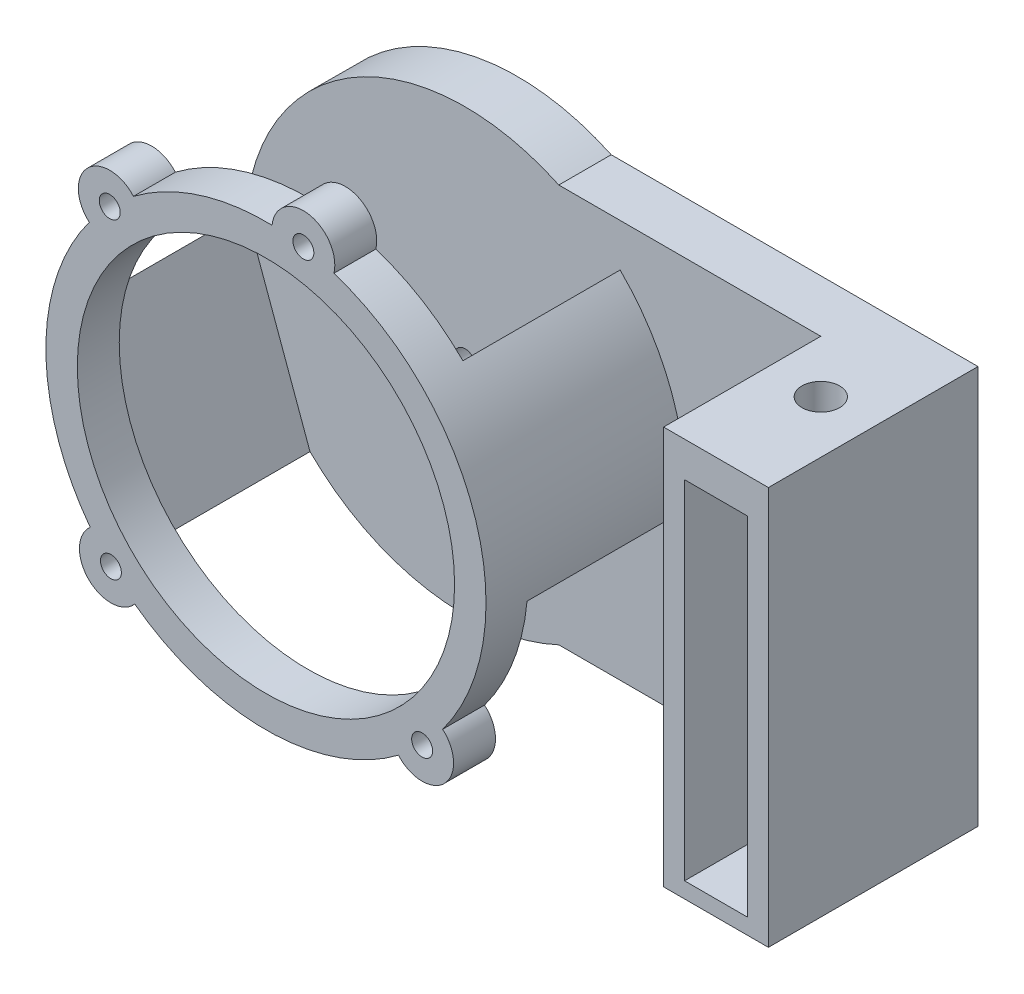
ISO-10303-21;
HEADER;
FILE_DESCRIPTION(('STEP AP214'),'2;1');
FILE_NAME('part.step','',(''),(''),'','','');
FILE_SCHEMA(('AUTOMOTIVE_DESIGN { 1 0 10303 214 1 1 1 1 }'));
ENDSEC;
DATA;
#1=APPLICATION_CONTEXT('core data for automotive mechanical design processes');
#2=APPLICATION_PROTOCOL_DEFINITION('international standard','automotive_design',2000,#1);
#3=PRODUCT_CONTEXT('',#1,'mechanical');
#4=PRODUCT('Part','Part','',(#3));
#5=PRODUCT_RELATED_PRODUCT_CATEGORY('part','',(#4));
#6=PRODUCT_DEFINITION_FORMATION('','',#4);
#7=PRODUCT_DEFINITION_CONTEXT('part definition',#1,'design');
#8=PRODUCT_DEFINITION('design','',#6,#7);
#9=PRODUCT_DEFINITION_SHAPE('','',#8);
#10=(LENGTH_UNIT() NAMED_UNIT(*) SI_UNIT(.MILLI.,.METRE.));
#11=(NAMED_UNIT(*) PLANE_ANGLE_UNIT() SI_UNIT($,.RADIAN.));
#12=(NAMED_UNIT(*) SI_UNIT($,.STERADIAN.) SOLID_ANGLE_UNIT());
#13=UNCERTAINTY_MEASURE_WITH_UNIT(LENGTH_MEASURE(1.E-05),#10,'distance_accuracy_value','');
#14=(GEOMETRIC_REPRESENTATION_CONTEXT(3) GLOBAL_UNCERTAINTY_ASSIGNED_CONTEXT((#13)) GLOBAL_UNIT_ASSIGNED_CONTEXT((#10,
#11,#12)) REPRESENTATION_CONTEXT('',''));
#15=CARTESIAN_POINT('',(0.,0.,0.));
#16=DIRECTION('',(0.,0.,1.));
#17=DIRECTION('',(1.,0.,0.));
#18=AXIS2_PLACEMENT_3D('',#15,#16,#17);
#19=CARTESIAN_POINT('',(3.42122795984325,-7.39064879229252,2.5));
#20=DIRECTION('',(0.,0.,-1.));
#21=DIRECTION('',(-1.,0.,0.));
#22=AXIS2_PLACEMENT_3D('',#19,#20,#21);
#23=CYLINDRICAL_SURFACE('',#22,21.);
#24=CARTESIAN_POINT('',(3.42122795984325,-7.39064879229252,21.5));
#25=DIRECTION('',(0.,0.,1.));
#26=DIRECTION('',(1.,0.,0.));
#27=AXIS2_PLACEMENT_3D('',#24,#25,#26);
#28=CIRCLE('',#27,21.);
#29=CARTESIAN_POINT('',(-9.09924347453269,-24.2500021328265,21.5));
#30=VERTEX_POINT('',#29);
#31=CARTESIAN_POINT('',(16.0642247504456,-24.1583150626122,21.5));
#32=VERTEX_POINT('',#31);
#33=EDGE_CURVE('E309',#30,#32,#28,.T.);
#34=ORIENTED_EDGE('',*,*,#33,.F.);
#35=DIRECTION('',(0.,0.,1.));
#36=VECTOR('',#35,1.);
#37=CARTESIAN_POINT('',(-9.09924347453272,-24.2500021328265,19.5));
#38=LINE('',#37,#36);
#39=CARTESIAN_POINT('',(-9.09924347453272,-24.2500021328265,17.5));
#40=VERTEX_POINT('',#39);
#41=EDGE_CURVE('E237',#30,#40,#38,.F.);
#42=ORIENTED_EDGE('',*,*,#41,.T.);
#43=CARTESIAN_POINT('',(3.42122795984325,-7.39064879229252,17.5));
#44=DIRECTION('',(0.,0.,1.));
#45=DIRECTION('',(1.,0.,0.));
#46=AXIS2_PLACEMENT_3D('',#43,#44,#45);
#47=CIRCLE('',#46,21.);
#48=CARTESIAN_POINT('',(16.0642247504456,-24.1583150626123,17.5));
#49=VERTEX_POINT('',#48);
#50=EDGE_CURVE('E287',#40,#49,#47,.T.);
#51=ORIENTED_EDGE('',*,*,#50,.T.);
#52=DIRECTION('',(0.,0.,1.));
#53=VECTOR('',#52,1.);
#54=CARTESIAN_POINT('',(16.0642247504456,-24.1583150626123,19.5));
#55=LINE('',#54,#53);
#56=EDGE_CURVE('E252',#49,#32,#55,.T.);
#57=ORIENTED_EDGE('',*,*,#56,.T.);
#58=EDGE_LOOP('',(#34,#42,#51,#57));
#59=FACE_BOUND('',#58,.T.);
#60=ADVANCED_FACE('F42',(#59),#23,.T.);
#61=CARTESIAN_POINT('',(3.42122795984325,-7.39064879229252,17.5));
#62=DIRECTION('',(0.,0.,1.));
#63=DIRECTION('',(1.,0.,0.));
#64=AXIS2_PLACEMENT_3D('',#61,#62,#63);
#65=CIRCLE('',#64,21.);
#66=CARTESIAN_POINT('',(-13.3464383104762,-20.0336455828953,17.5));
#67=VERTEX_POINT('',#66);
#68=CARTESIAN_POINT('',(-11.3738106744874,-22.2938978276091,17.5));
#69=VERTEX_POINT('',#68);
#70=EDGE_CURVE('E244',#67,#69,#65,.T.);
#71=ORIENTED_EDGE('',*,*,#70,.F.);
#72=DIRECTION('',(0.,0.,1.));
#73=VECTOR('',#72,1.);
#74=CARTESIAN_POINT('',(-13.3464383104762,-20.0336455828953,19.5));
#75=LINE('',#74,#73);
#76=CARTESIAN_POINT('',(-13.3464383104762,-20.0336455828953,21.5));
#77=VERTEX_POINT('',#76);
#78=EDGE_CURVE('E241',#67,#77,#75,.T.);
#79=ORIENTED_EDGE('',*,*,#78,.T.);
#80=CARTESIAN_POINT('',(-13.4381253806903,5.12982264208411,21.5));
#81=VERTEX_POINT('',#80);
#82=EDGE_CURVE('E306',#81,#77,#28,.T.);
#83=ORIENTED_EDGE('',*,*,#82,.F.);
#84=DIRECTION('',(0.,0.,1.));
#85=VECTOR('',#84,1.);
#86=CARTESIAN_POINT('',(-13.4381253806903,5.12982264208411,19.5));
#87=LINE('',#86,#85);
#88=CARTESIAN_POINT('',(-13.4381253806903,5.12982264208411,17.5));
#89=VERTEX_POINT('',#88);
#90=EDGE_CURVE('E268',#81,#89,#87,.F.);
#91=ORIENTED_EDGE('',*,*,#90,.T.);
#92=CARTESIAN_POINT('',(-17.4920529956907,-5.4841652033512,17.5));
#93=VERTEX_POINT('',#92);
#94=EDGE_CURVE('E289',#89,#93,#47,.T.);
#95=ORIENTED_EDGE('',*,*,#94,.T.);
#96=DIRECTION('',(0.,0.,-1.));
#97=VECTOR('',#96,1.);
#98=CARTESIAN_POINT('',(-17.4920529956907,-5.48416520335119,2.5));
#99=LINE('',#98,#97);
#100=CARTESIAN_POINT('',(-17.4920529956907,-5.4841652033512,2.5));
#101=VERTEX_POINT('',#100);
#102=EDGE_CURVE('E50',#93,#101,#99,.T.);
#103=ORIENTED_EDGE('',*,*,#102,.T.);
#104=CARTESIAN_POINT('',(3.42122795984325,-7.39064879229252,2.5));
#105=DIRECTION('',(0.,0.,-1.));
#106=DIRECTION('',(-1.,0.,0.));
#107=AXIS2_PLACEMENT_3D('',#104,#105,#106);
#108=CIRCLE('',#107,21.);
#109=CARTESIAN_POINT('',(12.3654998698424,11.6093512077075,2.5));
#110=VERTEX_POINT('',#109);
#111=EDGE_CURVE('E292',#101,#110,#108,.T.);
#112=ORIENTED_EDGE('',*,*,#111,.T.);
#113=DIRECTION('',(0.,0.,-1.));
#114=VECTOR('',#113,1.);
#115=CARTESIAN_POINT('',(12.3654998698424,11.6093512077075,2.5));
#116=LINE('',#115,#114);
#117=CARTESIAN_POINT('',(12.3654998698424,11.6093512077075,-2.5));
#118=VERTEX_POINT('',#117);
#119=EDGE_CURVE('E366',#110,#118,#116,.T.);
#120=ORIENTED_EDGE('',*,*,#119,.T.);
#121=CARTESIAN_POINT('',(3.42122795984325,-7.39064879229252,-2.5));
#122=DIRECTION('',(0.,0.,1.));
#123=DIRECTION('',(1.,0.,0.));
#124=AXIS2_PLACEMENT_3D('',#121,#122,#123);
#125=CIRCLE('',#124,21.);
#126=CARTESIAN_POINT('',(12.3654998698424,-26.3906487922925,-2.5));
#127=VERTEX_POINT('',#126);
#128=EDGE_CURVE('E360',#118,#127,#125,.T.);
#129=ORIENTED_EDGE('',*,*,#128,.T.);
#130=DIRECTION('',(0.,0.,-1.));
#131=VECTOR('',#130,1.);
#132=CARTESIAN_POINT('',(12.3654998698424,-26.3906487922925,2.5));
#133=LINE('',#132,#131);
#134=CARTESIAN_POINT('',(12.3654998698424,-26.3906487922925,2.5));
#135=VERTEX_POINT('',#134);
#136=EDGE_CURVE('E382',#135,#127,#133,.T.);
#137=ORIENTED_EDGE('',*,*,#136,.F.);
#138=CARTESIAN_POINT('',(-11.3738106744874,-22.2938978276091,2.5));
#139=VERTEX_POINT('',#138);
#140=EDGE_CURVE('E295',#135,#139,#108,.T.);
#141=ORIENTED_EDGE('',*,*,#140,.T.);
#142=DIRECTION('',(0.,0.,-1.));
#143=VECTOR('',#142,1.);
#144=CARTESIAN_POINT('',(-11.3738106744874,-22.2938978276091,2.5));
#145=LINE('',#144,#143);
#146=EDGE_CURVE('E12',#139,#69,#145,.F.);
#147=ORIENTED_EDGE('',*,*,#146,.T.);
#148=EDGE_LOOP('',(#71,#79,#83,#91,#95,#103,#112,#120,#129,#137,#141,#147));
#149=FACE_BOUND('',#148,.T.);
#150=ADVANCED_FACE('F394',(#149),#23,.T.);
#151=CARTESIAN_POINT('',(20.2805813003772,-19.9111202266686,21.5));
#152=VERTEX_POINT('',#151);
#153=CARTESIAN_POINT('',(9.90477101917935,12.5834261399223,21.5));
#154=VERTEX_POINT('',#153);
#155=EDGE_CURVE('E460',#152,#154,#28,.T.);
#156=ORIENTED_EDGE('',*,*,#155,.F.);
#157=DIRECTION('',(0.,0.,1.));
#158=VECTOR('',#157,1.);
#159=CARTESIAN_POINT('',(20.2805813003772,-19.9111202266686,19.5));
#160=LINE('',#159,#158);
#161=CARTESIAN_POINT('',(20.2805813003772,-19.9111202266686,17.5));
#162=VERTEX_POINT('',#161);
#163=EDGE_CURVE('E248',#152,#162,#160,.F.);
#164=ORIENTED_EDGE('',*,*,#163,.T.);
#165=CARTESIAN_POINT('',(24.3345089153772,-9.29713238123378,17.5));
#166=VERTEX_POINT('',#165);
#167=EDGE_CURVE('E290',#162,#166,#47,.T.);
#168=ORIENTED_EDGE('',*,*,#167,.T.);
#169=DIRECTION('',(0.,0.,-1.));
#170=VECTOR('',#169,1.);
#171=CARTESIAN_POINT('',(24.3345089153772,-9.29713238123379,2.5));
#172=LINE('',#171,#170);
#173=CARTESIAN_POINT('',(24.3345089153772,-9.29713238123375,2.5));
#174=VERTEX_POINT('',#173);
#175=EDGE_CURVE('E299',#166,#174,#172,.T.);
#176=ORIENTED_EDGE('',*,*,#175,.T.);
#177=CARTESIAN_POINT('',(3.42122795984325,-7.39064879229252,2.5));
#178=DIRECTION('',(0.,0.,1.));
#179=DIRECTION('',(1.,0.,0.));
#180=AXIS2_PLACEMENT_3D('',#177,#178,#179);
#181=CIRCLE('',#180,21.);
#182=CARTESIAN_POINT('',(18.216266594174,7.51260024302395,2.5));
#183=VERTEX_POINT('',#182);
#184=EDGE_CURVE('E385',#183,#174,#181,.F.);
#185=ORIENTED_EDGE('',*,*,#184,.F.);
#186=DIRECTION('',(0.,0.,-1.));
#187=VECTOR('',#186,1.);
#188=CARTESIAN_POINT('',(18.2162665941739,7.51260024302398,2.5));
#189=LINE('',#188,#187);
#190=CARTESIAN_POINT('',(18.216266594174,7.51260024302397,17.5));
#191=VERTEX_POINT('',#190);
#192=EDGE_CURVE('E296',#183,#191,#189,.F.);
#193=ORIENTED_EDGE('',*,*,#192,.T.);
#194=CARTESIAN_POINT('',(9.90477101917936,12.5834261399224,17.5));
#195=VERTEX_POINT('',#194);
#196=EDGE_CURVE('E291',#191,#195,#47,.T.);
#197=ORIENTED_EDGE('',*,*,#196,.T.);
#198=DIRECTION('',(0.,0.,1.));
#199=VECTOR('',#198,1.);
#200=CARTESIAN_POINT('',(9.90477101917936,12.5834261399224,19.5));
#201=LINE('',#200,#199);
#202=EDGE_CURVE('E262',#195,#154,#201,.T.);
#203=ORIENTED_EDGE('',*,*,#202,.T.);
#204=EDGE_LOOP('',(#156,#164,#168,#176,#185,#193,#197,#203));
#205=FACE_BOUND('',#204,.T.);
#206=ADVANCED_FACE('F446',(#205),#23,.T.);
#207=CARTESIAN_POINT('',(4.00726992252873,13.6011723487608,21.5));
#208=VERTEX_POINT('',#207);
#209=CARTESIAN_POINT('',(-9.22176883075965,9.3770174780268,21.5));
#210=VERTEX_POINT('',#209);
#211=EDGE_CURVE('E305',#208,#210,#28,.T.);
#212=ORIENTED_EDGE('',*,*,#211,.F.);
#213=DIRECTION('',(0.,0.,1.));
#214=VECTOR('',#213,1.);
#215=CARTESIAN_POINT('',(4.00726992252873,13.6011723487608,19.5));
#216=LINE('',#215,#214);
#217=CARTESIAN_POINT('',(4.00726992252873,13.6011723487608,17.5));
#218=VERTEX_POINT('',#217);
#219=EDGE_CURVE('E258',#208,#218,#216,.F.);
#220=ORIENTED_EDGE('',*,*,#219,.T.);
#221=CARTESIAN_POINT('',(-9.22176883075966,9.37701747802681,17.5));
#222=VERTEX_POINT('',#221);
#223=EDGE_CURVE('E481',#218,#222,#47,.T.);
#224=ORIENTED_EDGE('',*,*,#223,.T.);
#225=DIRECTION('',(0.,0.,1.));
#226=VECTOR('',#225,1.);
#227=CARTESIAN_POINT('',(-9.22176883075966,9.37701747802681,19.5));
#228=LINE('',#227,#226);
#229=EDGE_CURVE('E272',#222,#210,#228,.T.);
#230=ORIENTED_EDGE('',*,*,#229,.T.);
#231=EDGE_LOOP('',(#212,#220,#224,#230));
#232=FACE_BOUND('',#231,.T.);
#233=ADVANCED_FACE('F44',(#232),#23,.T.);
#234=CARTESIAN_POINT('',(12.3654998698424,-26.3906487922925,2.5));
#235=DIRECTION('',(0.,1.,0.));
#236=DIRECTION('',(0.,0.,1.));
#237=AXIS2_PLACEMENT_3D('',#234,#235,#236);
#238=PLANE('',#237);
#239=DIRECTION('',(1.,0.,0.));
#240=VECTOR('',#239,1.);
#241=CARTESIAN_POINT('',(12.3654998698424,-26.3906487922925,-2.5));
#242=LINE('',#241,#240);
#243=CARTESIAN_POINT('',(47.3654998698424,-26.3906487922925,-2.5));
#244=VERTEX_POINT('',#243);
#245=EDGE_CURVE('E369',#127,#244,#242,.T.);
#246=ORIENTED_EDGE('',*,*,#245,.T.);
#247=DIRECTION('',(0.,0.,-1.));
#248=VECTOR('',#247,1.);
#249=CARTESIAN_POINT('',(47.3654998698424,-26.3906487922925,2.5));
#250=LINE('',#249,#248);
#251=CARTESIAN_POINT('',(47.3654998698424,-26.3906487922925,17.5));
#252=VERTEX_POINT('',#251);
#253=EDGE_CURVE('E379',#252,#244,#250,.T.);
#254=ORIENTED_EDGE('',*,*,#253,.F.);
#255=DIRECTION('',(1.,0.,0.));
#256=VECTOR('',#255,1.);
#257=CARTESIAN_POINT('',(37.3654998698424,-26.3906487922925,17.5));
#258=LINE('',#257,#256);
#259=CARTESIAN_POINT('',(37.3654998698424,-26.3906487922925,17.5));
#260=VERTEX_POINT('',#259);
#261=EDGE_CURVE('E349',#260,#252,#258,.T.);
#262=ORIENTED_EDGE('',*,*,#261,.F.);
#263=DIRECTION('',(0.,0.,-1.));
#264=VECTOR('',#263,1.);
#265=CARTESIAN_POINT('',(37.3654998698424,-26.3906487922925,17.5));
#266=LINE('',#265,#264);
#267=CARTESIAN_POINT('',(37.3654998698424,-26.3906487922925,2.5));
#268=VERTEX_POINT('',#267);
#269=EDGE_CURVE('E352',#260,#268,#266,.T.);
#270=ORIENTED_EDGE('',*,*,#269,.T.);
#271=DIRECTION('',(1.,0.,0.));
#272=VECTOR('',#271,1.);
#273=CARTESIAN_POINT('',(12.3654998698424,-26.3906487922925,2.5));
#274=LINE('',#273,#272);
#275=EDGE_CURVE('E361',#135,#268,#274,.T.);
#276=ORIENTED_EDGE('',*,*,#275,.F.);
#277=ORIENTED_EDGE('',*,*,#136,.T.);
#278=EDGE_LOOP('',(#246,#254,#262,#270,#276,#277));
#279=FACE_BOUND('',#278,.T.);
#280=ADVANCED_FACE('F408',(#279),#238,.F.);
#281=CARTESIAN_POINT('',(47.3654998698424,-26.3906487922925,2.5));
#282=DIRECTION('',(-1.,0.,0.));
#283=DIRECTION('',(0.,0.,1.));
#284=AXIS2_PLACEMENT_3D('',#281,#282,#283);
#285=PLANE('',#284);
#286=DIRECTION('',(0.,1.,0.));
#287=VECTOR('',#286,1.);
#288=CARTESIAN_POINT('',(47.3654998698424,-26.3906487922925,-2.5));
#289=LINE('',#288,#287);
#290=CARTESIAN_POINT('',(47.3654998698424,11.6093512077075,-2.5));
#291=VERTEX_POINT('',#290);
#292=EDGE_CURVE('E371',#244,#291,#289,.T.);
#293=ORIENTED_EDGE('',*,*,#292,.T.);
#294=DIRECTION('',(0.,0.,-1.));
#295=VECTOR('',#294,1.);
#296=CARTESIAN_POINT('',(47.3654998698424,11.6093512077075,2.5));
#297=LINE('',#296,#295);
#298=CARTESIAN_POINT('',(47.3654998698424,11.6093512077075,17.5));
#299=VERTEX_POINT('',#298);
#300=EDGE_CURVE('E376',#299,#291,#297,.T.);
#301=ORIENTED_EDGE('',*,*,#300,.F.);
#302=DIRECTION('',(0.,1.,0.));
#303=VECTOR('',#302,1.);
#304=CARTESIAN_POINT('',(47.3654998698424,11.6093512077075,17.5));
#305=LINE('',#304,#303);
#306=EDGE_CURVE('E342',#252,#299,#305,.T.);
#307=ORIENTED_EDGE('',*,*,#306,.F.);
#308=ORIENTED_EDGE('',*,*,#253,.T.);
#309=EDGE_LOOP('',(#293,#301,#307,#308));
#310=FACE_BOUND('',#309,.T.);
#311=ADVANCED_FACE('F424',(#310),#285,.F.);
#312=CARTESIAN_POINT('',(47.3654998698424,11.6093512077075,2.5));
#313=DIRECTION('',(0.,-1.,0.));
#314=DIRECTION('',(1.,0.,0.));
#315=AXIS2_PLACEMENT_3D('',#312,#313,#314);
#316=PLANE('',#315);
#317=CARTESIAN_POINT('',(42.3654998698424,11.6093512077075,7.5));
#318=DIRECTION('',(0.,1.,0.));
#319=DIRECTION('',(0.,0.,1.));
#320=AXIS2_PLACEMENT_3D('',#317,#318,#319);
#321=CIRCLE('',#320,1.79999999999999);
#322=CARTESIAN_POINT('',(42.3654998698424,11.6093512077075,9.29999999999999));
#323=VERTEX_POINT('',#322);
#324=EDGE_CURVE('E853',#323,#323,#321,.T.);
#325=ORIENTED_EDGE('',*,*,#324,.F.);
#326=EDGE_LOOP('',(#325));
#327=FACE_BOUND('',#326,.T.);
#328=DIRECTION('',(-1.,0.,0.));
#329=VECTOR('',#328,1.);
#330=CARTESIAN_POINT('',(47.3654998698424,11.6093512077075,-2.5));
#331=LINE('',#330,#329);
#332=EDGE_CURVE('E364',#291,#118,#331,.T.);
#333=ORIENTED_EDGE('',*,*,#332,.T.);
#334=ORIENTED_EDGE('',*,*,#119,.F.);
#335=DIRECTION('',(-1.,0.,0.));
#336=VECTOR('',#335,1.);
#337=CARTESIAN_POINT('',(47.3654998698424,11.6093512077075,2.5));
#338=LINE('',#337,#336);
#339=CARTESIAN_POINT('',(37.3654998698424,11.6093512077075,2.5));
#340=VERTEX_POINT('',#339);
#341=EDGE_CURVE('E363',#340,#110,#338,.T.);
#342=ORIENTED_EDGE('',*,*,#341,.F.);
#343=DIRECTION('',(0.,0.,-1.));
#344=VECTOR('',#343,1.);
#345=CARTESIAN_POINT('',(37.3654998698424,11.6093512077075,17.5));
#346=LINE('',#345,#344);
#347=CARTESIAN_POINT('',(37.3654998698424,11.6093512077075,17.5));
#348=VERTEX_POINT('',#347);
#349=EDGE_CURVE('E357',#348,#340,#346,.T.);
#350=ORIENTED_EDGE('',*,*,#349,.F.);
#351=DIRECTION('',(-1.,0.,0.));
#352=VECTOR('',#351,1.);
#353=CARTESIAN_POINT('',(37.3654998698424,11.6093512077075,17.5));
#354=LINE('',#353,#352);
#355=EDGE_CURVE('E345',#299,#348,#354,.T.);
#356=ORIENTED_EDGE('',*,*,#355,.F.);
#357=ORIENTED_EDGE('',*,*,#300,.T.);
#358=EDGE_LOOP('',(#333,#334,#342,#350,#356,#357));
#359=FACE_BOUND('',#358,.T.);
#360=ADVANCED_FACE('F418',(#327,#359),#316,.F.);
#361=CARTESIAN_POINT('',(3.42122795984325,-7.39064879229252,2.5));
#362=DIRECTION('',(0.,0.,1.));
#363=DIRECTION('',(1.,0.,0.));
#364=AXIS2_PLACEMENT_3D('',#361,#362,#363);
#365=PLANE('',#364);
#366=CARTESIAN_POINT('',(3.42122795984325,-7.39064879229252,2.5));
#367=DIRECTION('',(0.,0.,1.));
#368=DIRECTION('',(1.,0.,0.));
#369=AXIS2_PLACEMENT_3D('',#366,#367,#368);
#370=CIRCLE('',#369,1.);
#371=CARTESIAN_POINT('',(4.42122795984325,-7.39064879229252,2.5));
#372=VERTEX_POINT('',#371);
#373=EDGE_CURVE('E854',#372,#372,#370,.T.);
#374=ORIENTED_EDGE('',*,*,#373,.F.);
#375=EDGE_LOOP('',(#374));
#376=FACE_BOUND('',#375,.T.);
#377=DIRECTION('',(-0.342020143325664,0.93969262078591,0.));
#378=VECTOR('',#377,1.);
#379=CARTESIAN_POINT('',(33.1651609597014,-33.5591494720759,2.5));
#380=LINE('',#379,#378);
#381=EDGE_CURVE('E280',#174,#183,#380,.T.);
#382=ORIENTED_EDGE('',*,*,#381,.T.);
#383=ORIENTED_EDGE('',*,*,#184,.T.);
#384=EDGE_LOOP('',(#382,#383));
#385=FACE_BOUND('',#384,.T.);
#386=ORIENTED_EDGE('',*,*,#341,.T.);
#387=ORIENTED_EDGE('',*,*,#111,.F.);
#388=DIRECTION('',(-0.342020143325664,0.93969262078591,0.));
#389=VECTOR('',#388,1.);
#390=CARTESIAN_POINT('',(-2.54315863016315,-46.5559149184511,2.5));
#391=LINE('',#390,#389);
#392=EDGE_CURVE('E276',#139,#101,#391,.T.);
#393=ORIENTED_EDGE('',*,*,#392,.F.);
#394=ORIENTED_EDGE('',*,*,#140,.F.);
#395=ORIENTED_EDGE('',*,*,#275,.T.);
#396=DIRECTION('',(0.,-1.,0.));
#397=VECTOR('',#396,1.);
#398=CARTESIAN_POINT('',(37.3654998698424,11.6093512077075,2.5));
#399=LINE('',#398,#397);
#400=EDGE_CURVE('E335',#340,#268,#399,.T.);
#401=ORIENTED_EDGE('',*,*,#400,.F.);
#402=EDGE_LOOP('',(#386,#387,#393,#394,#395,#401));
#403=FACE_BOUND('',#402,.T.);
#404=ADVANCED_FACE('F403',(#376,#385,#403),#365,.T.);
#405=CARTESIAN_POINT('',(3.42122795984325,-7.39064879229252,-2.5));
#406=DIRECTION('',(0.,0.,1.));
#407=DIRECTION('',(1.,0.,0.));
#408=AXIS2_PLACEMENT_3D('',#405,#406,#407);
#409=PLANE('',#408);
#410=DIRECTION('',(1.,0.,0.));
#411=VECTOR('',#410,1.);
#412=CARTESIAN_POINT('',(39.3654998698424,-24.8906487922925,-2.5));
#413=LINE('',#412,#411);
#414=CARTESIAN_POINT('',(39.3654998698424,-24.8906487922925,-2.5));
#415=VERTEX_POINT('',#414);
#416=CARTESIAN_POINT('',(45.3654998698424,-24.8906487922925,-2.5));
#417=VERTEX_POINT('',#416);
#418=EDGE_CURVE('E320',#415,#417,#413,.T.);
#419=ORIENTED_EDGE('',*,*,#418,.T.);
#420=DIRECTION('',(0.,1.,0.));
#421=VECTOR('',#420,1.);
#422=CARTESIAN_POINT('',(45.3654998698424,8.25935120770748,-2.5));
#423=LINE('',#422,#421);
#424=CARTESIAN_POINT('',(45.3654998698424,8.25935120770748,-2.5));
#425=VERTEX_POINT('',#424);
#426=EDGE_CURVE('E310',#417,#425,#423,.T.);
#427=ORIENTED_EDGE('',*,*,#426,.T.);
#428=DIRECTION('',(-1.,0.,0.));
#429=VECTOR('',#428,1.);
#430=CARTESIAN_POINT('',(39.3654998698424,8.25935120770748,-2.5));
#431=LINE('',#430,#429);
#432=CARTESIAN_POINT('',(39.3654998698424,8.25935120770748,-2.5));
#433=VERTEX_POINT('',#432);
#434=EDGE_CURVE('E313',#425,#433,#431,.T.);
#435=ORIENTED_EDGE('',*,*,#434,.T.);
#436=DIRECTION('',(0.,-1.,0.));
#437=VECTOR('',#436,1.);
#438=CARTESIAN_POINT('',(39.3654998698424,8.25935120770748,-2.5));
#439=LINE('',#438,#437);
#440=EDGE_CURVE('E317',#433,#415,#439,.T.);
#441=ORIENTED_EDGE('',*,*,#440,.T.);
#442=EDGE_LOOP('',(#419,#427,#435,#441));
#443=FACE_BOUND('',#442,.T.);
#444=ORIENTED_EDGE('',*,*,#128,.F.);
#445=ORIENTED_EDGE('',*,*,#332,.F.);
#446=ORIENTED_EDGE('',*,*,#292,.F.);
#447=ORIENTED_EDGE('',*,*,#245,.F.);
#448=EDGE_LOOP('',(#444,#445,#446,#447));
#449=FACE_BOUND('',#448,.T.);
#450=ADVANCED_FACE('F421',(#443,#449),#409,.F.);
#451=CARTESIAN_POINT('',(37.3654998698424,11.6093512077075,17.5));
#452=DIRECTION('',(1.,0.,0.));
#453=DIRECTION('',(0.,1.,0.));
#454=AXIS2_PLACEMENT_3D('',#451,#452,#453);
#455=PLANE('',#454);
#456=ORIENTED_EDGE('',*,*,#400,.T.);
#457=ORIENTED_EDGE('',*,*,#269,.F.);
#458=DIRECTION('',(0.,-1.,0.));
#459=VECTOR('',#458,1.);
#460=CARTESIAN_POINT('',(37.3654998698424,11.6093512077075,17.5));
#461=LINE('',#460,#459);
#462=EDGE_CURVE('E347',#348,#260,#461,.T.);
#463=ORIENTED_EDGE('',*,*,#462,.F.);
#464=ORIENTED_EDGE('',*,*,#349,.T.);
#465=EDGE_LOOP('',(#456,#457,#463,#464));
#466=FACE_BOUND('',#465,.T.);
#467=ADVANCED_FACE('F413',(#466),#455,.F.);
#468=CARTESIAN_POINT('',(0.,0.,17.5));
#469=DIRECTION('',(0.,0.,1.));
#470=DIRECTION('',(1.,0.,0.));
#471=AXIS2_PLACEMENT_3D('',#468,#469,#470);
#472=PLANE('',#471);
#473=DIRECTION('',(0.,1.,0.));
#474=VECTOR('',#473,1.);
#475=CARTESIAN_POINT('',(45.3654998698424,8.25935120770748,17.5));
#476=LINE('',#475,#474);
#477=CARTESIAN_POINT('',(45.3654998698424,-24.8906487922925,17.5));
#478=VERTEX_POINT('',#477);
#479=CARTESIAN_POINT('',(45.3654998698424,8.25935120770748,17.5));
#480=VERTEX_POINT('',#479);
#481=EDGE_CURVE('E308',#478,#480,#476,.T.);
#482=ORIENTED_EDGE('',*,*,#481,.F.);
#483=DIRECTION('',(1.,0.,0.));
#484=VECTOR('',#483,1.);
#485=CARTESIAN_POINT('',(39.3654998698424,-24.8906487922925,17.5));
#486=LINE('',#485,#484);
#487=CARTESIAN_POINT('',(39.3654998698424,-24.8906487922925,17.5));
#488=VERTEX_POINT('',#487);
#489=EDGE_CURVE('E314',#488,#478,#486,.T.);
#490=ORIENTED_EDGE('',*,*,#489,.F.);
#491=DIRECTION('',(0.,-1.,0.));
#492=VECTOR('',#491,1.);
#493=CARTESIAN_POINT('',(39.3654998698424,8.25935120770748,17.5));
#494=LINE('',#493,#492);
#495=CARTESIAN_POINT('',(39.3654998698424,8.25935120770748,17.5));
#496=VERTEX_POINT('',#495);
#497=EDGE_CURVE('E328',#496,#488,#494,.T.);
#498=ORIENTED_EDGE('',*,*,#497,.F.);
#499=DIRECTION('',(-1.,0.,0.));
#500=VECTOR('',#499,1.);
#501=CARTESIAN_POINT('',(39.3654998698424,8.25935120770748,17.5));
#502=LINE('',#501,#500);
#503=EDGE_CURVE('E325',#480,#496,#502,.T.);
#504=ORIENTED_EDGE('',*,*,#503,.F.);
#505=EDGE_LOOP('',(#482,#490,#498,#504));
#506=FACE_BOUND('',#505,.T.);
#507=ORIENTED_EDGE('',*,*,#306,.T.);
#508=ORIENTED_EDGE('',*,*,#355,.T.);
#509=ORIENTED_EDGE('',*,*,#462,.T.);
#510=ORIENTED_EDGE('',*,*,#261,.T.);
#511=EDGE_LOOP('',(#507,#508,#509,#510));
#512=FACE_BOUND('',#511,.T.);
#513=ADVANCED_FACE('F427',(#506,#512),#472,.T.);
#514=CARTESIAN_POINT('',(45.3654998698424,8.25935120770748,-2.5));
#515=DIRECTION('',(1.,0.,0.));
#516=DIRECTION('',(0.,1.,0.));
#517=AXIS2_PLACEMENT_3D('',#514,#515,#516);
#518=PLANE('',#517);
#519=ORIENTED_EDGE('',*,*,#481,.T.);
#520=DIRECTION('',(0.,0.,1.));
#521=VECTOR('',#520,1.);
#522=CARTESIAN_POINT('',(45.3654998698424,8.25935120770748,-2.5));
#523=LINE('',#522,#521);
#524=EDGE_CURVE('E323',#425,#480,#523,.T.);
#525=ORIENTED_EDGE('',*,*,#524,.F.);
#526=ORIENTED_EDGE('',*,*,#426,.F.);
#527=DIRECTION('',(0.,0.,1.));
#528=VECTOR('',#527,1.);
#529=CARTESIAN_POINT('',(45.3654998698424,-24.8906487922925,-2.5));
#530=LINE('',#529,#528);
#531=EDGE_CURVE('E333',#417,#478,#530,.T.);
#532=ORIENTED_EDGE('',*,*,#531,.T.);
#533=EDGE_LOOP('',(#519,#525,#526,#532));
#534=FACE_BOUND('',#533,.T.);
#535=ADVANCED_FACE('F429',(#534),#518,.F.);
#536=CARTESIAN_POINT('',(39.3654998698424,-24.8906487922925,-2.5));
#537=DIRECTION('',(0.,-1.,0.));
#538=DIRECTION('',(0.,0.,-1.));
#539=AXIS2_PLACEMENT_3D('',#536,#537,#538);
#540=PLANE('',#539);
#541=ORIENTED_EDGE('',*,*,#489,.T.);
#542=ORIENTED_EDGE('',*,*,#531,.F.);
#543=ORIENTED_EDGE('',*,*,#418,.F.);
#544=DIRECTION('',(0.,0.,1.));
#545=VECTOR('',#544,1.);
#546=CARTESIAN_POINT('',(39.3654998698424,-24.8906487922925,-2.5));
#547=LINE('',#546,#545);
#548=EDGE_CURVE('E336',#415,#488,#547,.T.);
#549=ORIENTED_EDGE('',*,*,#548,.T.);
#550=EDGE_LOOP('',(#541,#542,#543,#549));
#551=FACE_BOUND('',#550,.T.);
#552=ADVANCED_FACE('F436',(#551),#540,.F.);
#553=CARTESIAN_POINT('',(39.3654998698424,8.25935120770748,-2.5));
#554=DIRECTION('',(-1.,0.,0.));
#555=DIRECTION('',(0.,-1.,0.));
#556=AXIS2_PLACEMENT_3D('',#553,#554,#555);
#557=PLANE('',#556);
#558=ORIENTED_EDGE('',*,*,#497,.T.);
#559=ORIENTED_EDGE('',*,*,#548,.F.);
#560=ORIENTED_EDGE('',*,*,#440,.F.);
#561=DIRECTION('',(0.,0.,1.));
#562=VECTOR('',#561,1.);
#563=CARTESIAN_POINT('',(39.3654998698424,8.25935120770748,-2.5));
#564=LINE('',#563,#562);
#565=EDGE_CURVE('E338',#433,#496,#564,.T.);
#566=ORIENTED_EDGE('',*,*,#565,.T.);
#567=EDGE_LOOP('',(#558,#559,#560,#566));
#568=FACE_BOUND('',#567,.T.);
#569=ADVANCED_FACE('F523',(#568),#557,.F.);
#570=CARTESIAN_POINT('',(39.3654998698424,8.25935120770748,-2.5));
#571=DIRECTION('',(0.,1.,0.));
#572=DIRECTION('',(0.,0.,1.));
#573=AXIS2_PLACEMENT_3D('',#570,#571,#572);
#574=PLANE('',#573);
#575=CARTESIAN_POINT('',(42.3654998698424,8.25935120770748,7.5));
#576=DIRECTION('',(0.,1.,0.));
#577=DIRECTION('',(0.,0.,1.));
#578=AXIS2_PLACEMENT_3D('',#575,#576,#577);
#579=CIRCLE('',#578,1.79999999999999);
#580=CARTESIAN_POINT('',(42.3654998698424,8.25935120770748,9.29999999999999));
#581=VERTEX_POINT('',#580);
#582=EDGE_CURVE('E535',#581,#581,#579,.T.);
#583=ORIENTED_EDGE('',*,*,#582,.T.);
#584=EDGE_LOOP('',(#583));
#585=FACE_BOUND('',#584,.T.);
#586=ORIENTED_EDGE('',*,*,#503,.T.);
#587=ORIENTED_EDGE('',*,*,#565,.F.);
#588=ORIENTED_EDGE('',*,*,#434,.F.);
#589=ORIENTED_EDGE('',*,*,#524,.T.);
#590=EDGE_LOOP('',(#586,#587,#588,#589));
#591=FACE_BOUND('',#590,.T.);
#592=ADVANCED_FACE('F519',(#585,#591),#574,.F.);
#593=CARTESIAN_POINT('',(3.42122795984325,-7.39064879229252,21.5));
#594=DIRECTION('',(0.,0.,1.));
#595=DIRECTION('',(1.,0.,0.));
#596=AXIS2_PLACEMENT_3D('',#593,#594,#595);
#597=PLANE('',#596);
#598=CARTESIAN_POINT('',(6.99246163076135,13.3034636570903,21.5));
#599=DIRECTION('',(0.,0.,1.));
#600=DIRECTION('',(1.,0.,0.));
#601=AXIS2_PLACEMENT_3D('',#598,#599,#600);
#602=CIRCLE('',#601,0.999999999999988);
#603=CARTESIAN_POINT('',(7.99246163076134,13.3034636570903,21.5));
#604=VERTEX_POINT('',#603);
#605=EDGE_CURVE('E211',#604,#604,#602,.T.);
#606=ORIENTED_EDGE('',*,*,#605,.F.);
#607=EDGE_LOOP('',(#606));
#608=FACE_BOUND('',#607,.T.);
#609=CARTESIAN_POINT('',(-11.482021075473,7.40438984203837,21.5));
#610=DIRECTION('',(0.,0.,1.));
#611=DIRECTION('',(1.,0.,0.));
#612=AXIS2_PLACEMENT_3D('',#609,#610,#611);
#613=CIRCLE('',#612,0.999999999999989);
#614=CARTESIAN_POINT('',(-10.482021075473,7.40438984203837,21.5));
#615=VERTEX_POINT('',#614);
#616=EDGE_CURVE('E210',#615,#615,#613,.T.);
#617=ORIENTED_EDGE('',*,*,#616,.F.);
#618=EDGE_LOOP('',(#617));
#619=FACE_BOUND('',#618,.T.);
#620=CARTESIAN_POINT('',(-11.3738106744874,-22.293897827609,21.5));
#621=DIRECTION('',(0.,0.,1.));
#622=DIRECTION('',(1.,0.,0.));
#623=AXIS2_PLACEMENT_3D('',#620,#621,#622);
#624=CIRCLE('',#623,0.999999999999989);
#625=CARTESIAN_POINT('',(-10.3738106744874,-22.293897827609,21.5));
#626=VERTEX_POINT('',#625);
#627=EDGE_CURVE('E223',#626,#626,#624,.T.);
#628=ORIENTED_EDGE('',*,*,#627,.F.);
#629=EDGE_LOOP('',(#628));
#630=FACE_BOUND('',#629,.T.);
#631=CARTESIAN_POINT('',(18.3244769951596,-22.1856874266234,21.5));
#632=DIRECTION('',(0.,0.,1.));
#633=DIRECTION('',(1.,0.,0.));
#634=AXIS2_PLACEMENT_3D('',#631,#632,#633);
#635=CIRCLE('',#634,0.99999999999999);
#636=CARTESIAN_POINT('',(19.3244769951596,-22.1856874266234,21.5));
#637=VERTEX_POINT('',#636);
#638=EDGE_CURVE('E229',#637,#637,#635,.T.);
#639=ORIENTED_EDGE('',*,*,#638,.F.);
#640=EDGE_LOOP('',(#639));
#641=FACE_BOUND('',#640,.T.);
#642=ORIENTED_EDGE('',*,*,#82,.T.);
#643=CARTESIAN_POINT('',(-11.3738106744874,-22.293897827609,21.5));
#644=DIRECTION('',(0.,0.,1.));
#645=DIRECTION('',(1.,0.,0.));
#646=AXIS2_PLACEMENT_3D('',#643,#644,#645);
#647=CIRCLE('',#646,3.00000000000005);
#648=EDGE_CURVE('E57',#77,#30,#647,.T.);
#649=ORIENTED_EDGE('',*,*,#648,.T.);
#650=ORIENTED_EDGE('',*,*,#33,.T.);
#651=CARTESIAN_POINT('',(18.3244769951596,-22.1856874266234,21.5));
#652=DIRECTION('',(0.,0.,1.));
#653=DIRECTION('',(1.,0.,0.));
#654=AXIS2_PLACEMENT_3D('',#651,#652,#653);
#655=CIRCLE('',#654,3.0000000000002);
#656=EDGE_CURVE('E63',#32,#152,#655,.T.);
#657=ORIENTED_EDGE('',*,*,#656,.T.);
#658=ORIENTED_EDGE('',*,*,#155,.T.);
#659=CARTESIAN_POINT('',(6.99246163076135,13.3034636570903,21.5));
#660=DIRECTION('',(0.,0.,1.));
#661=DIRECTION('',(1.,0.,0.));
#662=AXIS2_PLACEMENT_3D('',#659,#660,#661);
#663=CIRCLE('',#662,2.9999999999995);
#664=EDGE_CURVE('E255',#154,#208,#663,.T.);
#665=ORIENTED_EDGE('',*,*,#664,.T.);
#666=ORIENTED_EDGE('',*,*,#211,.T.);
#667=CARTESIAN_POINT('',(-11.482021075473,7.40438984203837,21.5));
#668=DIRECTION('',(0.,0.,1.));
#669=DIRECTION('',(1.,0.,0.));
#670=AXIS2_PLACEMENT_3D('',#667,#668,#669);
#671=CIRCLE('',#670,2.99999999999953);
#672=EDGE_CURVE('E265',#210,#81,#671,.T.);
#673=ORIENTED_EDGE('',*,*,#672,.T.);
#674=EDGE_LOOP('',(#642,#649,#650,#657,#658,#665,#666,#673));
#675=FACE_BOUND('',#674,.T.);
#676=CARTESIAN_POINT('',(3.42122795984325,-7.39064879229252,21.5));
#677=DIRECTION('',(0.,0.,1.));
#678=DIRECTION('',(1.,0.,0.));
#679=AXIS2_PLACEMENT_3D('',#676,#677,#678);
#680=CIRCLE('',#679,18.);
#681=CARTESIAN_POINT('',(21.4212279598432,-7.39064879229252,21.5));
#682=VERTEX_POINT('',#681);
#683=EDGE_CURVE('E302',#682,#682,#680,.T.);
#684=ORIENTED_EDGE('',*,*,#683,.F.);
#685=EDGE_LOOP('',(#684));
#686=FACE_BOUND('',#685,.T.);
#687=ADVANCED_FACE('F463',(#608,#619,#630,#641,#675,#686),#597,.T.);
#688=CARTESIAN_POINT('',(3.42122795984325,-7.39064879229252,21.5));
#689=DIRECTION('',(0.,0.,-1.));
#690=DIRECTION('',(-1.,0.,0.));
#691=AXIS2_PLACEMENT_3D('',#688,#689,#690);
#692=CYLINDRICAL_SURFACE('',#691,18.);
#693=ORIENTED_EDGE('',*,*,#683,.T.);
#694=EDGE_LOOP('',(#693));
#695=FACE_BOUND('',#694,.T.);
#696=CARTESIAN_POINT('',(3.42122795984325,-7.39064879229252,17.5));
#697=DIRECTION('',(0.,0.,1.));
#698=DIRECTION('',(1.,0.,0.));
#699=AXIS2_PLACEMENT_3D('',#696,#697,#698);
#700=CIRCLE('',#699,18.);
#701=CARTESIAN_POINT('',(21.4212279598432,-7.39064879229252,17.5));
#702=VERTEX_POINT('',#701);
#703=EDGE_CURVE('E279',#702,#702,#700,.T.);
#704=ORIENTED_EDGE('',*,*,#703,.F.);
#705=EDGE_LOOP('',(#704));
#706=FACE_BOUND('',#705,.T.);
#707=ADVANCED_FACE('F513',(#695,#706),#692,.F.);
#708=CARTESIAN_POINT('',(-2.54315863016315,-46.5559149184511,2.5));
#709=DIRECTION('',(-0.93969262078591,-0.342020143325664,0.));
#710=DIRECTION('',(0.342020143325664,-0.93969262078591,0.));
#711=AXIS2_PLACEMENT_3D('',#708,#709,#710);
#712=PLANE('',#711);
#713=DIRECTION('',(-0.342020143325664,0.93969262078591,0.));
#714=VECTOR('',#713,1.);
#715=CARTESIAN_POINT('',(-2.54315863016315,-46.5559149184511,17.5));
#716=LINE('',#715,#714);
#717=EDGE_CURVE('E275',#69,#93,#716,.T.);
#718=ORIENTED_EDGE('',*,*,#717,.F.);
#719=ORIENTED_EDGE('',*,*,#146,.F.);
#720=ORIENTED_EDGE('',*,*,#392,.T.);
#721=ORIENTED_EDGE('',*,*,#102,.F.);
#722=EDGE_LOOP('',(#718,#719,#720,#721));
#723=FACE_BOUND('',#722,.T.);
#724=ADVANCED_FACE('F399',(#723),#712,.F.);
#725=CARTESIAN_POINT('',(33.1651609597014,-33.5591494720759,17.5));
#726=DIRECTION('',(0.93969262078591,0.342020143325664,0.));
#727=DIRECTION('',(-0.342020143325664,0.93969262078591,0.));
#728=AXIS2_PLACEMENT_3D('',#725,#726,#727);
#729=PLANE('',#728);
#730=DIRECTION('',(-0.342020143325664,0.93969262078591,0.));
#731=VECTOR('',#730,1.);
#732=CARTESIAN_POINT('',(33.1651609597014,-33.5591494720759,17.5));
#733=LINE('',#732,#731);
#734=EDGE_CURVE('E283',#166,#191,#733,.T.);
#735=ORIENTED_EDGE('',*,*,#734,.T.);
#736=ORIENTED_EDGE('',*,*,#192,.F.);
#737=ORIENTED_EDGE('',*,*,#381,.F.);
#738=ORIENTED_EDGE('',*,*,#175,.F.);
#739=EDGE_LOOP('',(#735,#736,#737,#738));
#740=FACE_BOUND('',#739,.T.);
#741=ADVANCED_FACE('F505',(#740),#729,.F.);
#742=CARTESIAN_POINT('',(-2.54315863016315,-46.5559149184511,17.5));
#743=DIRECTION('',(0.,0.,1.));
#744=DIRECTION('',(1.,0.,0.));
#745=AXIS2_PLACEMENT_3D('',#742,#743,#744);
#746=PLANE('',#745);
#747=ORIENTED_EDGE('',*,*,#717,.T.);
#748=ORIENTED_EDGE('',*,*,#94,.F.);
#749=CARTESIAN_POINT('',(-11.482021075473,7.40438984203837,17.5));
#750=DIRECTION('',(0.,0.,1.));
#751=DIRECTION('',(1.,0.,0.));
#752=AXIS2_PLACEMENT_3D('',#749,#750,#751);
#753=CIRCLE('',#752,2.99999999999953);
#754=EDGE_CURVE('E266',#222,#89,#753,.T.);
#755=ORIENTED_EDGE('',*,*,#754,.F.);
#756=ORIENTED_EDGE('',*,*,#223,.F.);
#757=CARTESIAN_POINT('',(6.99246163076135,13.3034636570903,17.5));
#758=DIRECTION('',(0.,0.,1.));
#759=DIRECTION('',(1.,0.,0.));
#760=AXIS2_PLACEMENT_3D('',#757,#758,#759);
#761=CIRCLE('',#760,2.9999999999995);
#762=EDGE_CURVE('E256',#195,#218,#761,.T.);
#763=ORIENTED_EDGE('',*,*,#762,.F.);
#764=ORIENTED_EDGE('',*,*,#196,.F.);
#765=ORIENTED_EDGE('',*,*,#734,.F.);
#766=ORIENTED_EDGE('',*,*,#167,.F.);
#767=CARTESIAN_POINT('',(18.3244769951596,-22.1856874266234,17.5));
#768=DIRECTION('',(0.,0.,1.));
#769=DIRECTION('',(1.,0.,0.));
#770=AXIS2_PLACEMENT_3D('',#767,#768,#769);
#771=CIRCLE('',#770,3.0000000000002);
#772=EDGE_CURVE('E246',#49,#162,#771,.T.);
#773=ORIENTED_EDGE('',*,*,#772,.F.);
#774=ORIENTED_EDGE('',*,*,#50,.F.);
#775=CARTESIAN_POINT('',(-11.3738106744874,-22.293897827609,17.5));
#776=DIRECTION('',(0.,0.,1.));
#777=DIRECTION('',(1.,0.,0.));
#778=AXIS2_PLACEMENT_3D('',#775,#776,#777);
#779=CIRCLE('',#778,3.00000000000005);
#780=EDGE_CURVE('E235',#67,#40,#779,.T.);
#781=ORIENTED_EDGE('',*,*,#780,.F.);
#782=ORIENTED_EDGE('',*,*,#70,.T.);
#783=EDGE_LOOP('',(#747,#748,#755,#756,#763,#764,#765,#766,#773,#774,#781,#782));
#784=FACE_BOUND('',#783,.T.);
#785=ORIENTED_EDGE('',*,*,#703,.T.);
#786=EDGE_LOOP('',(#785));
#787=FACE_BOUND('',#786,.T.);
#788=ADVANCED_FACE('F472',(#784,#787),#746,.F.);
#789=CARTESIAN_POINT('',(-11.482021075473,7.40438984203837,17.5));
#790=DIRECTION('',(0.,0.,1.));
#791=DIRECTION('',(1.,0.,0.));
#792=AXIS2_PLACEMENT_3D('',#789,#790,#791);
#793=CYLINDRICAL_SURFACE('',#792,2.99999999999953);
#794=ORIENTED_EDGE('',*,*,#229,.F.);
#795=ORIENTED_EDGE('',*,*,#754,.T.);
#796=ORIENTED_EDGE('',*,*,#90,.F.);
#797=ORIENTED_EDGE('',*,*,#672,.F.);
#798=EDGE_LOOP('',(#794,#795,#796,#797));
#799=FACE_BOUND('',#798,.T.);
#800=ADVANCED_FACE('F483',(#799),#793,.T.);
#801=CARTESIAN_POINT('',(6.99246163076135,13.3034636570903,17.5));
#802=DIRECTION('',(0.,0.,1.));
#803=DIRECTION('',(1.,0.,0.));
#804=AXIS2_PLACEMENT_3D('',#801,#802,#803);
#805=CYLINDRICAL_SURFACE('',#804,2.9999999999995);
#806=ORIENTED_EDGE('',*,*,#202,.F.);
#807=ORIENTED_EDGE('',*,*,#762,.T.);
#808=ORIENTED_EDGE('',*,*,#219,.F.);
#809=ORIENTED_EDGE('',*,*,#664,.F.);
#810=EDGE_LOOP('',(#806,#807,#808,#809));
#811=FACE_BOUND('',#810,.T.);
#812=ADVANCED_FACE('F479',(#811),#805,.T.);
#813=CARTESIAN_POINT('',(18.3244769951596,-22.1856874266234,17.5));
#814=DIRECTION('',(0.,0.,1.));
#815=DIRECTION('',(1.,0.,0.));
#816=AXIS2_PLACEMENT_3D('',#813,#814,#815);
#817=CYLINDRICAL_SURFACE('',#816,3.0000000000002);
#818=ORIENTED_EDGE('',*,*,#56,.F.);
#819=ORIENTED_EDGE('',*,*,#772,.T.);
#820=ORIENTED_EDGE('',*,*,#163,.F.);
#821=ORIENTED_EDGE('',*,*,#656,.F.);
#822=EDGE_LOOP('',(#818,#819,#820,#821));
#823=FACE_BOUND('',#822,.T.);
#824=ADVANCED_FACE('F467',(#823),#817,.T.);
#825=CARTESIAN_POINT('',(-11.3738106744874,-22.293897827609,17.5));
#826=DIRECTION('',(0.,0.,1.));
#827=DIRECTION('',(1.,0.,0.));
#828=AXIS2_PLACEMENT_3D('',#825,#826,#827);
#829=CYLINDRICAL_SURFACE('',#828,3.00000000000005);
#830=ORIENTED_EDGE('',*,*,#78,.F.);
#831=ORIENTED_EDGE('',*,*,#780,.T.);
#832=ORIENTED_EDGE('',*,*,#41,.F.);
#833=ORIENTED_EDGE('',*,*,#648,.F.);
#834=EDGE_LOOP('',(#830,#831,#832,#833));
#835=FACE_BOUND('',#834,.T.);
#836=ADVANCED_FACE('F487',(#835),#829,.T.);
#837=CARTESIAN_POINT('',(18.3244769951596,-22.1856874266234,18.5));
#838=DIRECTION('',(0.,0.,1.));
#839=DIRECTION('',(1.,0.,0.));
#840=AXIS2_PLACEMENT_3D('',#837,#838,#839);
#841=CONICAL_SURFACE('',#840,0.999999999999987,1.02974425867665);
#842=CARTESIAN_POINT('',(18.3244769951596,-22.1856874266234,17.8991393809724));
#843=VERTEX_POINT('',#842);
#844=VERTEX_LOOP('',#843);
#845=FACE_BOUND('',#844,.T.);
#846=CARTESIAN_POINT('',(18.3244769951596,-22.1856874266234,18.5));
#847=DIRECTION('',(0.,0.,1.));
#848=DIRECTION('',(1.,0.,0.));
#849=AXIS2_PLACEMENT_3D('',#846,#847,#848);
#850=CIRCLE('',#849,0.999999999999987);
#851=CARTESIAN_POINT('',(19.3244769951596,-22.1856874266234,18.5));
#852=VERTEX_POINT('',#851);
#853=EDGE_CURVE('E232',#852,#852,#850,.T.);
#854=ORIENTED_EDGE('',*,*,#853,.T.);
#855=EDGE_LOOP('',(#854));
#856=FACE_BOUND('',#855,.T.);
#857=ADVANCED_FACE('F489',(#845,#856),#841,.F.);
#858=CARTESIAN_POINT('',(18.3244769951596,-22.1856874266234,21.5));
#859=DIRECTION('',(0.,0.,1.));
#860=DIRECTION('',(1.,0.,0.));
#861=AXIS2_PLACEMENT_3D('',#858,#859,#860);
#862=CYLINDRICAL_SURFACE('',#861,0.999999999999989);
#863=ORIENTED_EDGE('',*,*,#853,.F.);
#864=EDGE_LOOP('',(#863));
#865=FACE_BOUND('',#864,.T.);
#866=ORIENTED_EDGE('',*,*,#638,.T.);
#867=EDGE_LOOP('',(#866));
#868=FACE_BOUND('',#867,.T.);
#869=ADVANCED_FACE('F495',(#865,#868),#862,.F.);
#870=CARTESIAN_POINT('',(-11.3738106744874,-22.293897827609,18.5));
#871=DIRECTION('',(0.,0.,1.));
#872=DIRECTION('',(1.,0.,0.));
#873=AXIS2_PLACEMENT_3D('',#870,#871,#872);
#874=CONICAL_SURFACE('',#873,0.999999999999987,1.02974425867665);
#875=CARTESIAN_POINT('',(-11.3738106744874,-22.293897827609,17.8991393809724));
#876=VERTEX_POINT('',#875);
#877=VERTEX_LOOP('',#876);
#878=FACE_BOUND('',#877,.T.);
#879=CARTESIAN_POINT('',(-11.3738106744874,-22.293897827609,18.5));
#880=DIRECTION('',(0.,0.,1.));
#881=DIRECTION('',(1.,0.,0.));
#882=AXIS2_PLACEMENT_3D('',#879,#880,#881);
#883=CIRCLE('',#882,0.999999999999987);
#884=CARTESIAN_POINT('',(-10.3738106744874,-22.293897827609,18.5));
#885=VERTEX_POINT('',#884);
#886=EDGE_CURVE('E226',#885,#885,#883,.T.);
#887=ORIENTED_EDGE('',*,*,#886,.T.);
#888=EDGE_LOOP('',(#887));
#889=FACE_BOUND('',#888,.T.);
#890=ADVANCED_FACE('F696',(#878,#889),#874,.F.);
#891=CARTESIAN_POINT('',(-11.3738106744874,-22.293897827609,21.5));
#892=DIRECTION('',(0.,0.,1.));
#893=DIRECTION('',(1.,0.,0.));
#894=AXIS2_PLACEMENT_3D('',#891,#892,#893);
#895=CYLINDRICAL_SURFACE('',#894,0.999999999999988);
#896=ORIENTED_EDGE('',*,*,#886,.F.);
#897=EDGE_LOOP('',(#896));
#898=FACE_BOUND('',#897,.T.);
#899=ORIENTED_EDGE('',*,*,#627,.T.);
#900=EDGE_LOOP('',(#899));
#901=FACE_BOUND('',#900,.T.);
#902=ADVANCED_FACE('F705',(#898,#901),#895,.F.);
#903=CARTESIAN_POINT('',(-11.482021075473,7.40438984203837,18.5));
#904=DIRECTION('',(0.,0.,1.));
#905=DIRECTION('',(1.,0.,0.));
#906=AXIS2_PLACEMENT_3D('',#903,#904,#905);
#907=CONICAL_SURFACE('',#906,0.999999999999987,1.02974425867665);
#908=CARTESIAN_POINT('',(-11.482021075473,7.40438984203837,17.8991393809724));
#909=VERTEX_POINT('',#908);
#910=VERTEX_LOOP('',#909);
#911=FACE_BOUND('',#910,.T.);
#912=CARTESIAN_POINT('',(-11.482021075473,7.40438984203837,18.5));
#913=DIRECTION('',(0.,0.,1.));
#914=DIRECTION('',(1.,0.,0.));
#915=AXIS2_PLACEMENT_3D('',#912,#913,#914);
#916=CIRCLE('',#915,0.999999999999987);
#917=CARTESIAN_POINT('',(-10.482021075473,7.40438984203837,18.5));
#918=VERTEX_POINT('',#917);
#919=EDGE_CURVE('E214',#918,#918,#916,.T.);
#920=ORIENTED_EDGE('',*,*,#919,.T.);
#921=EDGE_LOOP('',(#920));
#922=FACE_BOUND('',#921,.T.);
#923=ADVANCED_FACE('F715',(#911,#922),#907,.F.);
#924=CARTESIAN_POINT('',(-11.482021075473,7.40438984203837,21.5));
#925=DIRECTION('',(0.,0.,1.));
#926=DIRECTION('',(1.,0.,0.));
#927=AXIS2_PLACEMENT_3D('',#924,#925,#926);
#928=CYLINDRICAL_SURFACE('',#927,0.999999999999988);
#929=ORIENTED_EDGE('',*,*,#919,.F.);
#930=EDGE_LOOP('',(#929));
#931=FACE_BOUND('',#930,.T.);
#932=ORIENTED_EDGE('',*,*,#616,.T.);
#933=EDGE_LOOP('',(#932));
#934=FACE_BOUND('',#933,.T.);
#935=ADVANCED_FACE('F204',(#931,#934),#928,.F.);
#936=CARTESIAN_POINT('',(6.99246163076135,13.3034636570903,18.5));
#937=DIRECTION('',(0.,0.,1.));
#938=DIRECTION('',(1.,0.,0.));
#939=AXIS2_PLACEMENT_3D('',#936,#937,#938);
#940=CONICAL_SURFACE('',#939,0.999999999999988,1.02974425867665);
#941=CARTESIAN_POINT('',(6.99246163076135,13.3034636570903,17.8991393809724));
#942=VERTEX_POINT('',#941);
#943=VERTEX_LOOP('',#942);
#944=FACE_BOUND('',#943,.T.);
#945=CARTESIAN_POINT('',(6.99246163076135,13.3034636570903,18.5));
#946=DIRECTION('',(0.,0.,1.));
#947=DIRECTION('',(1.,0.,0.));
#948=AXIS2_PLACEMENT_3D('',#945,#946,#947);
#949=CIRCLE('',#948,0.999999999999988);
#950=CARTESIAN_POINT('',(7.99246163076134,13.3034636570903,18.5));
#951=VERTEX_POINT('',#950);
#952=EDGE_CURVE('E208',#951,#951,#949,.T.);
#953=ORIENTED_EDGE('',*,*,#952,.T.);
#954=EDGE_LOOP('',(#953));
#955=FACE_BOUND('',#954,.T.);
#956=ADVANCED_FACE('F200',(#944,#955),#940,.F.);
#957=CARTESIAN_POINT('',(6.99246163076135,13.3034636570903,21.5));
#958=DIRECTION('',(0.,0.,1.));
#959=DIRECTION('',(1.,0.,0.));
#960=AXIS2_PLACEMENT_3D('',#957,#958,#959);
#961=CYLINDRICAL_SURFACE('',#960,0.999999999999988);
#962=ORIENTED_EDGE('',*,*,#952,.F.);
#963=EDGE_LOOP('',(#962));
#964=FACE_BOUND('',#963,.T.);
#965=ORIENTED_EDGE('',*,*,#605,.T.);
#966=EDGE_LOOP('',(#965));
#967=FACE_BOUND('',#966,.T.);
#968=ADVANCED_FACE('F203',(#964,#967),#961,.F.);
#969=CARTESIAN_POINT('',(3.42122795984325,-7.39064879229252,-0.5));
#970=DIRECTION('',(0.,0.,1.));
#971=DIRECTION('',(1.,0.,0.));
#972=AXIS2_PLACEMENT_3D('',#969,#970,#971);
#973=CYLINDRICAL_SURFACE('',#972,1.);
#974=CARTESIAN_POINT('',(3.42122795984325,-7.39064879229252,-0.5));
#975=DIRECTION('',(0.,0.,1.));
#976=DIRECTION('',(1.,0.,0.));
#977=AXIS2_PLACEMENT_3D('',#974,#975,#976);
#978=CIRCLE('',#977,1.);
#979=CARTESIAN_POINT('',(4.42122795984325,-7.39064879229252,-0.5));
#980=VERTEX_POINT('',#979);
#981=EDGE_CURVE('E217',#980,#980,#978,.T.);
#982=ORIENTED_EDGE('',*,*,#981,.F.);
#983=EDGE_LOOP('',(#982));
#984=FACE_BOUND('',#983,.T.);
#985=ORIENTED_EDGE('',*,*,#373,.T.);
#986=EDGE_LOOP('',(#985));
#987=FACE_BOUND('',#986,.T.);
#988=ADVANCED_FACE('F583',(#984,#987),#973,.F.);
#989=CARTESIAN_POINT('',(3.42122795984325,-7.39064879229252,-0.5));
#990=DIRECTION('',(0.,0.,1.));
#991=DIRECTION('',(1.,0.,0.));
#992=AXIS2_PLACEMENT_3D('',#989,#990,#991);
#993=PLANE('',#992);
#994=ORIENTED_EDGE('',*,*,#981,.T.);
#995=EDGE_LOOP('',(#994));
#996=FACE_BOUND('',#995,.T.);
#997=ADVANCED_FACE('F587',(#996),#993,.T.);
#998=CARTESIAN_POINT('',(42.3654998698424,11.6093512077075,7.5));
#999=DIRECTION('',(0.,1.,0.));
#1000=DIRECTION('',(0.,0.,1.));
#1001=AXIS2_PLACEMENT_3D('',#998,#999,#1000);
#1002=CYLINDRICAL_SURFACE('',#1001,1.79999999999999);
#1003=ORIENTED_EDGE('',*,*,#324,.T.);
#1004=EDGE_LOOP('',(#1003));
#1005=FACE_BOUND('',#1004,.T.);
#1006=ORIENTED_EDGE('',*,*,#582,.F.);
#1007=EDGE_LOOP('',(#1006));
#1008=FACE_BOUND('',#1007,.T.);
#1009=ADVANCED_FACE('F596',(#1005,#1008),#1002,.F.);
#1010=CLOSED_SHELL('',(#60,#150,#206,#233,#280,#311,#360,#404,#450,#467,#513,#535,#552,#569,
#592,#687,#707,#724,#741,#788,#800,#812,#824,#836,#857,#869,#890,#902,#923,#935,#956,#968,#988,
#997,#1009));
#1011=MANIFOLD_SOLID_BREP('B2',#1010);
#1012=ADVANCED_BREP_SHAPE_REPRESENTATION('',(#18,#1011),#14);
#1013=SHAPE_DEFINITION_REPRESENTATION(#9,#1012);
ENDSEC;
END-ISO-10303-21;
